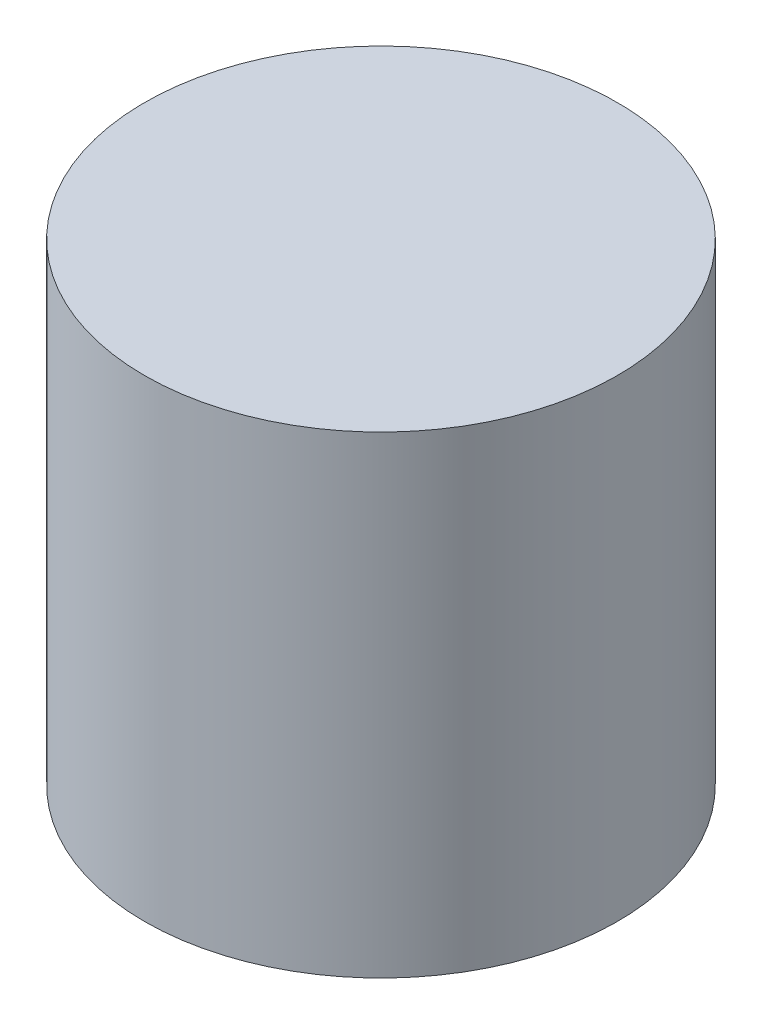
ISO-10303-21;
HEADER;
FILE_DESCRIPTION(('STEP AP214'),'2;1');
FILE_NAME('part.step','',(''),(''),'','','');
FILE_SCHEMA(('AUTOMOTIVE_DESIGN { 1 0 10303 214 1 1 1 1 }'));
ENDSEC;
DATA;
#1=APPLICATION_CONTEXT('core data for automotive mechanical design processes');
#2=APPLICATION_PROTOCOL_DEFINITION('international standard','automotive_design',2000,#1);
#3=PRODUCT_CONTEXT('',#1,'mechanical');
#4=PRODUCT('Part','Part','',(#3));
#5=PRODUCT_RELATED_PRODUCT_CATEGORY('part','',(#4));
#6=PRODUCT_DEFINITION_FORMATION('','',#4);
#7=PRODUCT_DEFINITION_CONTEXT('part definition',#1,'design');
#8=PRODUCT_DEFINITION('design','',#6,#7);
#9=PRODUCT_DEFINITION_SHAPE('','',#8);
#10=(LENGTH_UNIT() NAMED_UNIT(*) SI_UNIT(.MILLI.,.METRE.));
#11=(NAMED_UNIT(*) PLANE_ANGLE_UNIT() SI_UNIT($,.RADIAN.));
#12=(NAMED_UNIT(*) SI_UNIT($,.STERADIAN.) SOLID_ANGLE_UNIT());
#13=UNCERTAINTY_MEASURE_WITH_UNIT(LENGTH_MEASURE(1.E-05),#10,'distance_accuracy_value','');
#14=(GEOMETRIC_REPRESENTATION_CONTEXT(3) GLOBAL_UNCERTAINTY_ASSIGNED_CONTEXT((#13)) GLOBAL_UNIT_ASSIGNED_CONTEXT((#10,
#11,#12)) REPRESENTATION_CONTEXT('',''));
#15=CARTESIAN_POINT('',(0.,0.,0.));
#16=DIRECTION('',(0.,0.,1.));
#17=DIRECTION('',(1.,0.,0.));
#18=AXIS2_PLACEMENT_3D('',#15,#16,#17);
#19=CARTESIAN_POINT('',(0.,35.,0.));
#20=DIRECTION('',(0.,-1.,0.));
#21=DIRECTION('',(0.,0.,-1.));
#22=AXIS2_PLACEMENT_3D('',#19,#20,#21);
#23=CYLINDRICAL_SURFACE('',#22,17.5);
#24=CARTESIAN_POINT('',(0.,35.,0.));
#25=DIRECTION('',(0.,1.,0.));
#26=DIRECTION('',(0.,0.,1.));
#27=AXIS2_PLACEMENT_3D('',#24,#25,#26);
#28=CIRCLE('',#27,17.5);
#29=CARTESIAN_POINT('',(0.,35.,17.5));
#30=VERTEX_POINT('',#29);
#31=EDGE_CURVE('E10',#30,#30,#28,.T.);
#32=ORIENTED_EDGE('',*,*,#31,.F.);
#33=EDGE_LOOP('',(#32));
#34=FACE_BOUND('',#33,.T.);
#35=CARTESIAN_POINT('',(0.,0.,0.));
#36=DIRECTION('',(0.,1.,0.));
#37=DIRECTION('',(0.,0.,1.));
#38=AXIS2_PLACEMENT_3D('',#35,#36,#37);
#39=CIRCLE('',#38,17.5);
#40=CARTESIAN_POINT('',(0.,0.,17.5));
#41=VERTEX_POINT('',#40);
#42=EDGE_CURVE('E35',#41,#41,#39,.T.);
#43=ORIENTED_EDGE('',*,*,#42,.T.);
#44=EDGE_LOOP('',(#43));
#45=FACE_BOUND('',#44,.T.);
#46=ADVANCED_FACE('F32',(#34,#45),#23,.T.);
#47=CARTESIAN_POINT('',(0.,35.,0.));
#48=DIRECTION('',(0.,1.,0.));
#49=DIRECTION('',(0.,0.,1.));
#50=AXIS2_PLACEMENT_3D('',#47,#48,#49);
#51=PLANE('',#50);
#52=ORIENTED_EDGE('',*,*,#31,.T.);
#53=EDGE_LOOP('',(#52));
#54=FACE_BOUND('',#53,.T.);
#55=ADVANCED_FACE('F47',(#54),#51,.T.);
#56=CARTESIAN_POINT('',(0.,0.,0.));
#57=DIRECTION('',(0.,1.,0.));
#58=DIRECTION('',(0.,0.,1.));
#59=AXIS2_PLACEMENT_3D('',#56,#57,#58);
#60=PLANE('',#59);
#61=ORIENTED_EDGE('',*,*,#42,.F.);
#62=EDGE_LOOP('',(#61));
#63=FACE_BOUND('',#62,.T.);
#64=ADVANCED_FACE('F45',(#63),#60,.F.);
#65=CLOSED_SHELL('',(#46,#55,#64));
#66=MANIFOLD_SOLID_BREP('B2',#65);
#67=ADVANCED_BREP_SHAPE_REPRESENTATION('',(#18,#66),#14);
#68=SHAPE_DEFINITION_REPRESENTATION(#9,#67);
ENDSEC;
END-ISO-10303-21;
